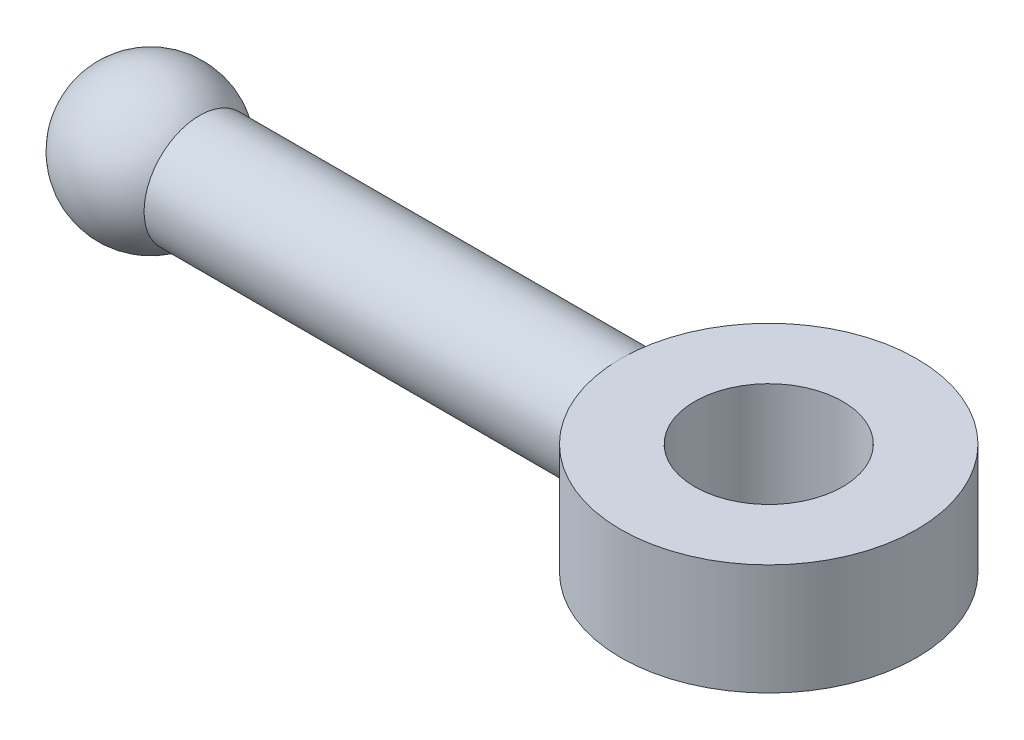
ISO-10303-21;
HEADER;
FILE_DESCRIPTION(('STEP AP214'),'2;1');
FILE_NAME('part.step','',(''),(''),'','','');
FILE_SCHEMA(('AUTOMOTIVE_DESIGN { 1 0 10303 214 1 1 1 1 }'));
ENDSEC;
DATA;
#1=APPLICATION_CONTEXT('core data for automotive mechanical design processes');
#2=APPLICATION_PROTOCOL_DEFINITION('international standard','automotive_design',2000,#1);
#3=PRODUCT_CONTEXT('',#1,'mechanical');
#4=PRODUCT('Part','Part','',(#3));
#5=PRODUCT_RELATED_PRODUCT_CATEGORY('part','',(#4));
#6=PRODUCT_DEFINITION_FORMATION('','',#4);
#7=PRODUCT_DEFINITION_CONTEXT('part definition',#1,'design');
#8=PRODUCT_DEFINITION('design','',#6,#7);
#9=PRODUCT_DEFINITION_SHAPE('','',#8);
#10=(LENGTH_UNIT() NAMED_UNIT(*) SI_UNIT(.MILLI.,.METRE.));
#11=(NAMED_UNIT(*) PLANE_ANGLE_UNIT() SI_UNIT($,.RADIAN.));
#12=(NAMED_UNIT(*) SI_UNIT($,.STERADIAN.) SOLID_ANGLE_UNIT());
#13=UNCERTAINTY_MEASURE_WITH_UNIT(LENGTH_MEASURE(1.E-05),#10,'distance_accuracy_value','');
#14=(GEOMETRIC_REPRESENTATION_CONTEXT(3) GLOBAL_UNCERTAINTY_ASSIGNED_CONTEXT((#13)) GLOBAL_UNIT_ASSIGNED_CONTEXT((#10,
#11,#12)) REPRESENTATION_CONTEXT('',''));
#15=CARTESIAN_POINT('',(0.,0.,0.));
#16=DIRECTION('',(0.,0.,1.));
#17=DIRECTION('',(1.,0.,0.));
#18=AXIS2_PLACEMENT_3D('',#15,#16,#17);
#19=CARTESIAN_POINT('',(130.,0.,0.));
#20=DIRECTION('',(-1.,0.,0.));
#21=DIRECTION('',(0.,0.,1.));
#22=AXIS2_PLACEMENT_3D('',#19,#20,#21);
#23=CYLINDRICAL_SURFACE('',#22,15.);
#24=CARTESIAN_POINT('',(13.2287565553229,0.,0.));
#25=DIRECTION('',(-1.,0.,0.));
#26=DIRECTION('',(0.,0.,1.));
#27=AXIS2_PLACEMENT_3D('',#24,#25,#26);
#28=CIRCLE('',#27,15.);
#29=CARTESIAN_POINT('',(13.2287565553229,0.,15.));
#30=VERTEX_POINT('',#29);
#31=EDGE_CURVE('E11',#30,#30,#28,.T.);
#32=ORIENTED_EDGE('',*,*,#31,.F.);
#33=EDGE_LOOP('',(#32));
#34=FACE_BOUND('',#33,.T.);
#35=CARTESIAN_POINT('',(130.,0.,15.));
#36=CARTESIAN_POINT('',(130.000001789508,-0.405018238840349,15.0000019710561));
#37=CARTESIAN_POINT('',(129.993346503051,-0.810009906363087,14.983582838618));
#38=CARTESIAN_POINT('',(129.966954853708,-1.61688859593652,14.9180920921327));
#39=CARTESIAN_POINT('',(129.947219586832,-2.01877587525895,14.8690232139032));
#40=CARTESIAN_POINT('',(129.895322977854,-2.81645986996204,14.7387544008871));
#41=CARTESIAN_POINT('',(129.863162202807,-3.21225686242461,14.6575559323759));
#42=CARTESIAN_POINT('',(129.787451234859,-3.9949945456558,14.4638370140702));
#43=CARTESIAN_POINT('',(129.743900706632,-4.38193497531399,14.3513156420935));
#44=CARTESIAN_POINT('',(129.64688161329,-5.14343806840588,14.0963076206503));
#45=CARTESIAN_POINT('',(129.593437747573,-5.51802887827162,13.9538954795851));
#46=CARTESIAN_POINT('',(129.478138311947,-6.25352562680119,13.6401347540359));
#47=CARTESIAN_POINT('',(129.416282809298,-6.61443167485932,13.4687864009241));
#48=CARTESIAN_POINT('',(129.285892280507,-7.32052049674851,13.098432271331));
#49=CARTESIAN_POINT('',(129.21735678372,-7.66570216018404,12.8994245456586));
#50=CARTESIAN_POINT('',(129.075421078422,-8.33856515109894,12.4750395444064));
#51=CARTESIAN_POINT('',(129.002019113942,-8.66624008375371,12.2496527277512));
#52=CARTESIAN_POINT('',(128.848882234961,-9.3165756921035,11.7632324815944));
#53=CARTESIAN_POINT('',(128.769010986522,-9.63834595385056,11.5010508154005));
#54=CARTESIAN_POINT('',(128.608199718063,-10.2589288289107,10.9510861924653));
#55=CARTESIAN_POINT('',(128.527259664401,-10.5577407175541,10.6633024282247));
#56=CARTESIAN_POINT('',(128.366419587813,-11.1307597651683,10.0637076511766));
#57=CARTESIAN_POINT('',(128.286519972674,-11.4049575111854,9.75188753038756));
#58=CARTESIAN_POINT('',(128.129906286813,-11.9268208994757,9.10621725815444));
#59=CARTESIAN_POINT('',(128.053191119715,-12.1744957205231,8.77237479302638));
#60=CARTESIAN_POINT('',(127.902371397232,-12.6497778115782,8.07267331592732));
#61=CARTESIAN_POINT('',(127.828446642641,-12.8764053673365,7.70610889618836));
#62=CARTESIAN_POINT('',(127.688194780835,-13.2978194726211,6.95369853867077));
#63=CARTESIAN_POINT('',(127.621867896206,-13.4926050893713,6.56785203647608));
#64=CARTESIAN_POINT('',(127.498733852927,-13.8485771385138,5.77960739552581));
#65=CARTESIAN_POINT('',(127.441924139924,-14.0097725891415,5.3772137341535));
#66=CARTESIAN_POINT('',(127.339474744885,-14.2970716627572,4.55870939869836));
#67=CARTESIAN_POINT('',(127.293834444373,-14.4231772287977,4.14259948556119));
#68=CARTESIAN_POINT('',(127.216792395242,-14.6343322242808,3.31806371221357));
#69=CARTESIAN_POINT('',(127.184861470382,-14.7209177283324,2.91008039601876));
#70=CARTESIAN_POINT('',(127.133378192007,-14.8598809243382,2.08755415156488));
#71=CARTESIAN_POINT('',(127.113825513573,-14.9122595141979,1.67301139577867));
#72=CARTESIAN_POINT('',(127.087661553282,-14.9822418037826,0.840709146415258));
#73=CARTESIAN_POINT('',(127.081046675301,-14.9998551666841,0.422950579109347));
#74=CARTESIAN_POINT('',(127.080938868579,-15.0001430388494,-0.412574219462028));
#75=CARTESIAN_POINT('',(127.087445543056,-14.9828186045947,-0.83034045011376));
#76=CARTESIAN_POINT('',(127.112746483232,-14.9151465424235,-1.64192683458252));
#77=CARTESIAN_POINT('',(127.130915952162,-14.8664776719746,-2.035907854384));
#78=CARTESIAN_POINT('',(127.178463492058,-14.7382279242331,-2.81810147424946));
#79=CARTESIAN_POINT('',(127.207841123973,-14.6586482577898,-3.20631429964891));
#80=CARTESIAN_POINT('',(127.277058387955,-14.4693096392682,-3.97435898050589));
#81=CARTESIAN_POINT('',(127.316898393413,-14.3595496100751,-4.35419053631938));
#82=CARTESIAN_POINT('',(127.406045387082,-14.1108077703876,-5.10301574404334));
#83=CARTESIAN_POINT('',(127.455352621887,-13.9718251987159,-5.47200911335957));
#84=CARTESIAN_POINT('',(127.563005340515,-13.6635449704538,-6.20216530356746));
#85=CARTESIAN_POINT('',(127.621471582872,-13.4938367217262,-6.56313682823734));
#86=CARTESIAN_POINT('',(127.745470207719,-13.1268096647946,-7.26947630030542));
#87=CARTESIAN_POINT('',(127.811002614073,-12.9294907633424,-7.61484419500098));
#88=CARTESIAN_POINT('',(127.947560045568,-12.5086030020053,-8.28809218771911));
#89=CARTESIAN_POINT('',(128.01858562133,-12.285031509464,-8.61597052705522));
#90=CARTESIAN_POINT('',(128.164457323857,-11.8130054201304,-9.25256651907369));
#91=CARTESIAN_POINT('',(128.239304811858,-11.5645419269155,-9.56127725692985));
#92=CARTESIAN_POINT('',(128.39545549292,-11.0290580247375,-10.1752313980938));
#93=CARTESIAN_POINT('',(128.476880488076,-10.7406335453899,-10.4792204837107));
#94=CARTESIAN_POINT('',(128.639825107921,-10.1393822245703,-11.0620176758651));
#95=CARTESIAN_POINT('',(128.721344737025,-9.82655419560348,-11.3408245555916));
#96=CARTESIAN_POINT('',(128.882292133712,-9.17819911690853,-11.8716581113024));
#97=CARTESIAN_POINT('',(128.961718981329,-8.84266230851357,-12.1236731528686));
#98=CARTESIAN_POINT('',(129.116183466246,-8.15108943235202,-12.5990370908513));
#99=CARTESIAN_POINT('',(129.191222721473,-7.79506101820509,-12.8223965907547));
#100=CARTESIAN_POINT('',(129.33636407682,-7.05627679009852,-13.2436321416282));
#101=CARTESIAN_POINT('',(129.406317304039,-6.67310010904496,-13.4408226014446));
#102=CARTESIAN_POINT('',(129.537128919723,-5.88988346233143,-13.802001110222));
#103=CARTESIAN_POINT('',(129.597987107662,-5.48984312511342,-13.9659884271536));
#104=CARTESIAN_POINT('',(129.708522537715,-4.67589203365127,-14.2591391851583));
#105=CARTESIAN_POINT('',(129.758204877727,-4.26198770291019,-14.3883185093546));
#106=CARTESIAN_POINT('',(129.844653155425,-3.42328358734263,-14.6105884562569));
#107=CARTESIAN_POINT('',(129.881419980179,-2.99848455294186,-14.7036815574971));
#108=CARTESIAN_POINT('',(129.939041788666,-2.1651004858357,-14.8486104629317));
#109=CARTESIAN_POINT('',(129.960662877367,-1.75691430572442,-14.902439492251));
#110=CARTESIAN_POINT('',(129.990424982877,-0.937011291624734,-14.9763617701412));
#111=CARTESIAN_POINT('',(129.998566497016,-0.525294588458375,-14.9964562633481));
#112=CARTESIAN_POINT('',(130.00108624813,0.298344499664327,-15.0026852854048));
#113=CARTESIAN_POINT('',(129.995467511783,0.710266819467504,-14.9888272823749));
#114=CARTESIAN_POINT('',(129.97066840721,1.53116167062215,-14.9273221744675));
#115=CARTESIAN_POINT('',(129.951488302261,1.94013425908337,-14.8796757255516));
#116=CARTESIAN_POINT('',(129.901448597804,2.73265669746122,-14.7541799830662));
#117=CARTESIAN_POINT('',(129.87118792467,3.11649051081202,-14.6778750783081));
#118=CARTESIAN_POINT('',(129.799886075867,3.87606283538481,-14.4958150842486));
#119=CARTESIAN_POINT('',(129.758845317207,4.25180165913862,-14.3900611341206));
#120=CARTESIAN_POINT('',(129.667183236492,4.99282741148441,-14.1500305501423));
#121=CARTESIAN_POINT('',(129.616562169609,5.3581146181562,-14.0157546759597));
#122=CARTESIAN_POINT('',(129.507134554055,6.07624973256898,-13.7196975815228));
#123=CARTESIAN_POINT('',(129.448324823977,6.42909273846988,-13.5579056654747));
#124=CARTESIAN_POINT('',(129.321801012931,7.13308143538917,-13.2015344940631));
#125=CARTESIAN_POINT('',(129.253837723492,7.48367970539698,-13.0059624202634));
#126=CARTESIAN_POINT('',(129.112642341005,8.16747197461971,-12.587815165948));
#127=CARTESIAN_POINT('',(129.039407912187,8.500658143818,-12.3652279840196));
#128=CARTESIAN_POINT('',(128.889610142427,9.14771939137408,-11.8945075952625));
#129=CARTESIAN_POINT('',(128.813046473863,9.46159256181778,-11.6463718709683));
#130=CARTESIAN_POINT('',(128.658533513727,10.0683383435295,-11.1260192822063));
#131=CARTESIAN_POINT('',(128.580584177065,10.3612102698517,-10.8538016329639));
#132=CARTESIAN_POINT('',(128.420272232848,10.9423116019478,-10.2687124532944));
#133=CARTESIAN_POINT('',(128.337944663187,11.2290578919147,-9.95435598748781));
#134=CARTESIAN_POINT('',(128.17618884672,11.7750465457466,-9.30210212507283));
#135=CARTESIAN_POINT('',(128.09675959181,12.0342985337906,-8.96421303495852));
#136=CARTESIAN_POINT('',(127.942923372362,12.523674819555,-8.26674587006042));
#137=CARTESIAN_POINT('',(127.868517585869,12.7537922959955,-7.90716274503004));
#138=CARTESIAN_POINT('',(127.726804485415,13.1830637871254,-7.16862899285511));
#139=CARTESIAN_POINT('',(127.659497008494,13.3822185126999,-6.78967881063138));
#140=CARTESIAN_POINT('',(127.534082046843,13.7472694536062,-6.01621377338198));
#141=CARTESIAN_POINT('',(127.475944092896,13.9132763263739,-5.62175615109486));
#142=CARTESIAN_POINT('',(127.370252216532,14.211344829063,-4.81882260982999));
#143=CARTESIAN_POINT('',(127.322698348489,14.3434062845977,-4.4103466188483));
#144=CARTESIAN_POINT('',(127.239581750087,14.5722123257076,-3.58258778864707));
#145=CARTESIAN_POINT('',(127.204014372495,14.6689705997422,-3.16330920568243));
#146=CARTESIAN_POINT('',(127.145910520569,14.8261971046861,-2.31711797574847));
#147=CARTESIAN_POINT('',(127.123373296767,14.8866674228128,-1.89020576930615));
#148=CARTESIAN_POINT('',(127.092924963144,14.9681950875083,-1.05730394103434));
#149=CARTESIAN_POINT('',(127.084237472537,14.991345433276,-0.651546233526879));
#150=CARTESIAN_POINT('',(127.079253980449,15.0046367834224,0.16057693010543));
#151=CARTESIAN_POINT('',(127.082957467451,14.9947791504158,0.566942360450434));
#152=CARTESIAN_POINT('',(127.102653580786,14.9421607369763,1.37718473937484));
#153=CARTESIAN_POINT('',(127.118644806597,14.8994037063217,1.78106196626477));
#154=CARTESIAN_POINT('',(127.162481493639,14.7814245502383,2.58338920250932));
#155=CARTESIAN_POINT('',(127.190326946592,14.7062024474794,2.98183921565351));
#156=CARTESIAN_POINT('',(127.256308612688,14.5262610303095,3.76079945580955));
#157=CARTESIAN_POINT('',(127.294176374723,14.4223084485444,4.14151009009668));
#158=CARTESIAN_POINT('',(127.379536603073,14.185127098198,4.89257156986833));
#159=CARTESIAN_POINT('',(127.427028846269,14.0518990082875,5.26292265528574));
#160=CARTESIAN_POINT('',(127.530485811048,13.7572380112915,5.99104989843195));
#161=CARTESIAN_POINT('',(127.586451657942,13.5958013576154,6.34882437817602));
#162=CARTESIAN_POINT('',(127.705515407507,13.2459517267163,7.04969387426149));
#163=CARTESIAN_POINT('',(127.768613573886,13.0575377519719,7.392788347181));
#164=CARTESIAN_POINT('',(127.903222282417,12.6466166833372,8.07642983751134));
#165=CARTESIAN_POINT('',(127.974974237327,12.4230135665016,8.41627067299996));
#166=CARTESIAN_POINT('',(128.122850503421,11.9493703307053,9.07621066075231));
#167=CARTESIAN_POINT('',(128.198976752074,11.6993184551449,9.39630093285203));
#168=CARTESIAN_POINT('',(128.353685959205,11.1743975977396,10.0148585877907));
#169=CARTESIAN_POINT('',(128.432269168431,10.899526077473,10.313323753289));
#170=CARTESIAN_POINT('',(128.589920558414,10.3265897911336,10.8869593847497));
#171=CARTESIAN_POINT('',(128.668988750207,10.0285244955486,11.162129318584));
#172=CARTESIAN_POINT('',(128.829744676438,9.39451256901851,11.7015118849485));
#173=CARTESIAN_POINT('',(128.911349947018,9.05739637626381,11.964376425284));
#174=CARTESIAN_POINT('',(129.070510755645,8.36130961167899,12.4607885016088));
#175=CARTESIAN_POINT('',(129.14806618222,8.00233843887707,12.6943352308708));
#176=CARTESIAN_POINT('',(129.296803230846,7.26467086452585,13.1304286002361));
#177=CARTESIAN_POINT('',(129.367983736267,6.88597102560714,13.3329698138044));
#178=CARTESIAN_POINT('',(129.501700332719,6.11135793130102,13.7053259902402));
#179=CARTESIAN_POINT('',(129.564236900934,5.71544562770375,13.875142759843));
#180=CARTESIAN_POINT('',(129.681105896243,4.89132395665363,14.1872305574549));
#181=CARTESIAN_POINT('',(129.734955933434,4.46246006734988,14.3279597632787));
#182=CARTESIAN_POINT('',(129.828905718439,3.59235140084261,14.5704833126249));
#183=CARTESIAN_POINT('',(129.869004847612,3.15110606757531,14.672275904449));
#184=CARTESIAN_POINT('',(129.933824886563,2.26035886838529,14.8356221453727));
#185=CARTESIAN_POINT('',(129.95855440516,1.81086176996909,14.8971983214558));
#186=CARTESIAN_POINT('',(129.991640000292,0.907564989995944,14.9793837448178));
#187=CARTESIAN_POINT('',(129.999997995109,0.453765818782814,14.9999977917096));
#188=CARTESIAN_POINT('',(130.,0.,15.));
#189=B_SPLINE_CURVE_WITH_KNOTS('',3,(#35,#36,#37,#38,#39,#40,#41,#42,#43,#44,#45,#46,#47,#48,
#49,#50,#51,#52,#53,#54,#55,#56,#57,#58,#59,#60,#61,#62,#63,#64,#65,#66,#67,#68,#69,#70,#71,#72,
#73,#74,#75,#76,#77,#78,#79,#80,#81,#82,#83,#84,#85,#86,#87,#88,#89,#90,#91,#92,#93,#94,#95,#96,
#97,#98,#99,#100,#101,#102,#103,#104,#105,#106,#107,#108,#109,#110,#111,#112,#113,#114,#115,
#116,#117,#118,#119,#120,#121,#122,#123,#124,#125,#126,#127,#128,#129,#130,#131,#132,#133,#134,
#135,#136,#137,#138,#139,#140,#141,#142,#143,#144,#145,#146,#147,#148,#149,#150,#151,#152,#153,
#154,#155,#156,#157,#158,#159,#160,#161,#162,#163,#164,#165,#166,#167,#168,#169,#170,#171,#172,
#173,#174,#175,#176,#177,#178,#179,#180,#181,#182,#183,#184,#185,#186,#187,#188),.UNSPECIFIED.,
.T.,.F.,(4,2,2,2,2,2,2,2,2,2,2,2,2,2,2,2,2,2,2,2,2,2,2,2,2,2,2,2,2,2,2,2,2,2,2,2,2,2,2,2,2,2,2,
2,2,2,2,2,2,2,2,2,2,2,2,2,2,2,2,2,2,2,2,2,2,2,2,2,2,2,2,2,2,2,2,2,4),(0.,1.21462389662666,
2.42914602918022,3.64361274183604,4.85811521357121,6.06962551704457,7.28112613381097,
8.49271216988891,9.70473778771172,10.9713477714869,12.2379977187663,13.5051300136007,
14.7718223657887,16.0819626176739,17.3921412418582,18.701967656832,20.0117215275861,
21.2649898533653,22.5182252804865,23.7711123151871,25.0239614644946,26.2147347071556,
27.4054613091066,28.5962304127244,29.7870305368733,30.9951083398448,32.2031902229001,
33.4113933581762,34.6200298573039,35.8992185782191,37.1784695842783,38.4582738582282,
39.7376031884241,41.0456863828135,42.3537984133644,43.6613125287998,44.9687368234443,
46.2040132103394,47.4392440206986,48.6742031566511,49.90913831803,51.0853340093501,
52.2614842083681,53.4376030851199,54.6141801817564,55.8343573620738,57.0550786017611,
58.2759202424439,59.4968016822228,60.7954242741706,62.0935907818839,63.3920606702013,
64.6905007420715,65.9845309716468,67.2785678488733,68.572102441544,69.8655626253166,
71.0835839063116,72.3015549063335,73.519387106094,74.737218455454,75.9252533508013,
77.1132607077822,78.301425973021,79.4896351835644,80.7275202851868,81.9659579636204,
83.2045224466777,84.4431152143769,85.7471804606793,87.0512815825909,88.3556106858507,
89.659867755702,91.0215441888771,92.3832818745737,93.7442561354088,95.1050709188221),.UNSPECIFIED.);
#190=CARTESIAN_POINT('',(127.080992435478,-15.,0.));
#191=VERTEX_POINT('',#190);
#192=CARTESIAN_POINT('',(127.080992435478,15.,0.));
#193=VERTEX_POINT('',#192);
#194=EDGE_CURVE('E43',#191,#193,#189,.T.);
#195=ORIENTED_EDGE('',*,*,#194,.F.);
#196=EDGE_CURVE('E50',#193,#191,#189,.T.);
#197=ORIENTED_EDGE('',*,*,#196,.F.);
#198=EDGE_LOOP('',(#195,#197));
#199=FACE_BOUND('',#198,.T.);
#200=ADVANCED_FACE('F35',(#34,#199),#23,.T.);
#201=CARTESIAN_POINT('',(0.,0.,0.));
#202=DIRECTION('',(-1.,0.,0.));
#203=DIRECTION('',(0.,-1.,0.));
#204=AXIS2_PLACEMENT_3D('',#201,#202,#203);
#205=SPHERICAL_SURFACE('',#204,20.);
#206=ORIENTED_EDGE('',*,*,#31,.T.);
#207=EDGE_LOOP('',(#206));
#208=FACE_BOUND('',#207,.T.);
#209=ADVANCED_FACE('F75',(#208),#205,.T.);
#210=CARTESIAN_POINT('',(167.080992435478,15.,0.));
#211=DIRECTION('',(0.,-1.,0.));
#212=DIRECTION('',(0.,0.,-1.));
#213=AXIS2_PLACEMENT_3D('',#210,#211,#212);
#214=CYLINDRICAL_SURFACE('',#213,40.);
#215=CARTESIAN_POINT('',(167.080992435478,-15.,0.));
#216=DIRECTION('',(0.,1.,0.));
#217=DIRECTION('',(0.,0.,1.));
#218=AXIS2_PLACEMENT_3D('',#215,#216,#217);
#219=CIRCLE('',#218,40.);
#220=EDGE_CURVE('E57',#191,#191,#219,.T.);
#221=ORIENTED_EDGE('',*,*,#220,.T.);
#222=ORIENTED_EDGE('',*,*,#194,.T.);
#223=CARTESIAN_POINT('',(167.080992435478,15.,0.));
#224=DIRECTION('',(0.,1.,0.));
#225=DIRECTION('',(0.,0.,1.));
#226=AXIS2_PLACEMENT_3D('',#223,#224,#225);
#227=CIRCLE('',#226,40.);
#228=EDGE_CURVE('E55',#193,#193,#227,.T.);
#229=ORIENTED_EDGE('',*,*,#228,.F.);
#230=ORIENTED_EDGE('',*,*,#196,.T.);
#231=EDGE_LOOP('',(#221,#222,#229,#230));
#232=FACE_BOUND('',#231,.T.);
#233=ADVANCED_FACE('F53',(#232),#214,.T.);
#234=CARTESIAN_POINT('',(167.080992435478,15.,0.));
#235=DIRECTION('',(0.,1.,0.));
#236=DIRECTION('',(0.,0.,1.));
#237=AXIS2_PLACEMENT_3D('',#234,#235,#236);
#238=PLANE('',#237);
#239=ORIENTED_EDGE('',*,*,#228,.T.);
#240=EDGE_LOOP('',(#239));
#241=FACE_BOUND('',#240,.T.);
#242=CARTESIAN_POINT('',(167.080992435478,15.,0.));
#243=DIRECTION('',(0.,1.,0.));
#244=DIRECTION('',(0.,0.,1.));
#245=AXIS2_PLACEMENT_3D('',#242,#243,#244);
#246=CIRCLE('',#245,20.);
#247=CARTESIAN_POINT('',(167.080992435478,15.,20.));
#248=VERTEX_POINT('',#247);
#249=EDGE_CURVE('E63',#248,#248,#246,.T.);
#250=ORIENTED_EDGE('',*,*,#249,.F.);
#251=EDGE_LOOP('',(#250));
#252=FACE_BOUND('',#251,.T.);
#253=ADVANCED_FACE('F60',(#241,#252),#238,.T.);
#254=CARTESIAN_POINT('',(167.080992435478,-15.,0.));
#255=DIRECTION('',(0.,1.,0.));
#256=DIRECTION('',(0.,0.,1.));
#257=AXIS2_PLACEMENT_3D('',#254,#255,#256);
#258=PLANE('',#257);
#259=ORIENTED_EDGE('',*,*,#220,.F.);
#260=EDGE_LOOP('',(#259));
#261=FACE_BOUND('',#260,.T.);
#262=CARTESIAN_POINT('',(167.080992435478,-15.,0.));
#263=DIRECTION('',(0.,1.,0.));
#264=DIRECTION('',(0.,0.,1.));
#265=AXIS2_PLACEMENT_3D('',#262,#263,#264);
#266=CIRCLE('',#265,20.);
#267=CARTESIAN_POINT('',(167.080992435478,-15.,20.));
#268=VERTEX_POINT('',#267);
#269=EDGE_CURVE('E66',#268,#268,#266,.T.);
#270=ORIENTED_EDGE('',*,*,#269,.T.);
#271=EDGE_LOOP('',(#270));
#272=FACE_BOUND('',#271,.T.);
#273=ADVANCED_FACE('F76',(#261,#272),#258,.F.);
#274=CARTESIAN_POINT('',(167.080992435478,15.,0.));
#275=DIRECTION('',(0.,-1.,0.));
#276=DIRECTION('',(0.,0.,-1.));
#277=AXIS2_PLACEMENT_3D('',#274,#275,#276);
#278=CYLINDRICAL_SURFACE('',#277,20.);
#279=ORIENTED_EDGE('',*,*,#249,.T.);
#280=EDGE_LOOP('',(#279));
#281=FACE_BOUND('',#280,.T.);
#282=ORIENTED_EDGE('',*,*,#269,.F.);
#283=EDGE_LOOP('',(#282));
#284=FACE_BOUND('',#283,.T.);
#285=ADVANCED_FACE('F112',(#281,#284),#278,.F.);
#286=CLOSED_SHELL('',(#200,#209,#233,#253,#273,#285));
#287=MANIFOLD_SOLID_BREP('B2',#286);
#288=ADVANCED_BREP_SHAPE_REPRESENTATION('',(#18,#287),#14);
#289=SHAPE_DEFINITION_REPRESENTATION(#9,#288);
ENDSEC;
END-ISO-10303-21;
